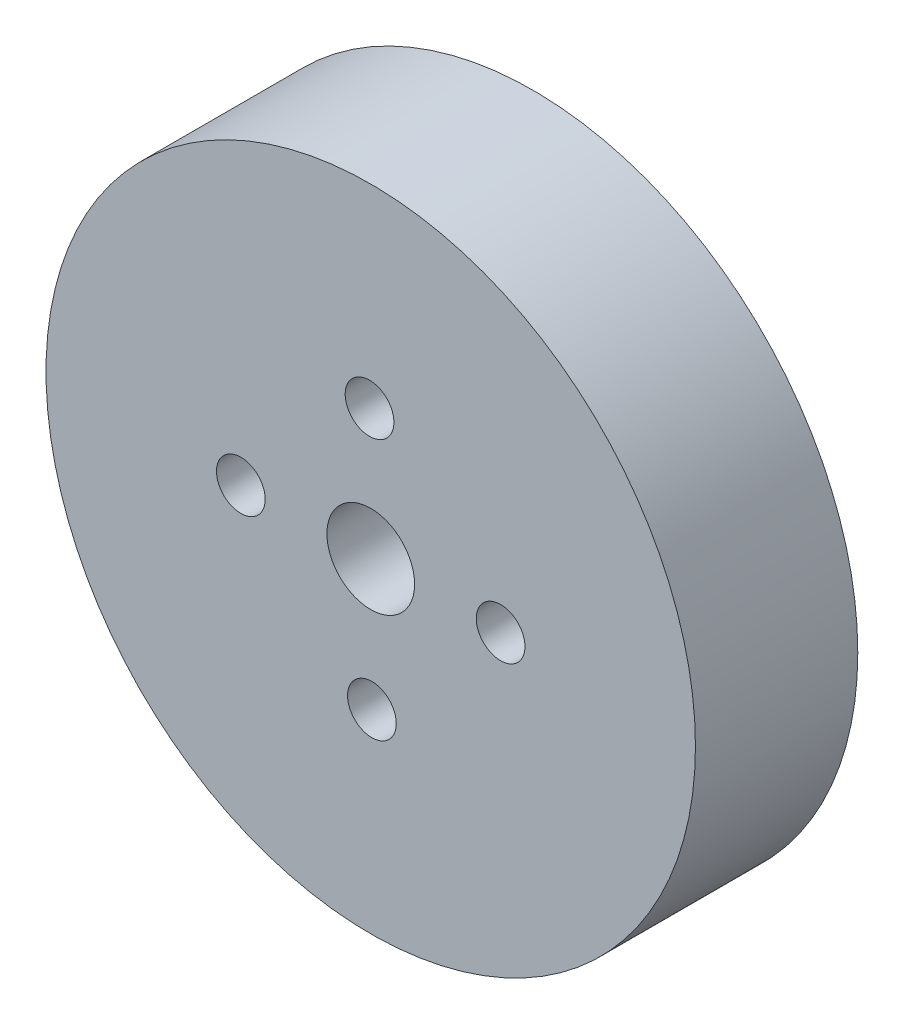
ISO-10303-21;
HEADER;
FILE_DESCRIPTION(('STEP AP214'),'2;1');
FILE_NAME('part.step','',(''),(''),'','','');
FILE_SCHEMA(('AUTOMOTIVE_DESIGN { 1 0 10303 214 1 1 1 1 }'));
ENDSEC;
DATA;
#1=APPLICATION_CONTEXT('core data for automotive mechanical design processes');
#2=APPLICATION_PROTOCOL_DEFINITION('international standard','automotive_design',2000,#1);
#3=PRODUCT_CONTEXT('',#1,'mechanical');
#4=PRODUCT('Part','Part','',(#3));
#5=PRODUCT_RELATED_PRODUCT_CATEGORY('part','',(#4));
#6=PRODUCT_DEFINITION_FORMATION('','',#4);
#7=PRODUCT_DEFINITION_CONTEXT('part definition',#1,'design');
#8=PRODUCT_DEFINITION('design','',#6,#7);
#9=PRODUCT_DEFINITION_SHAPE('','',#8);
#10=(LENGTH_UNIT() NAMED_UNIT(*) SI_UNIT(.MILLI.,.METRE.));
#11=(NAMED_UNIT(*) PLANE_ANGLE_UNIT() SI_UNIT($,.RADIAN.));
#12=(NAMED_UNIT(*) SI_UNIT($,.STERADIAN.) SOLID_ANGLE_UNIT());
#13=UNCERTAINTY_MEASURE_WITH_UNIT(LENGTH_MEASURE(1.E-05),#10,'distance_accuracy_value','');
#14=(GEOMETRIC_REPRESENTATION_CONTEXT(3) GLOBAL_UNCERTAINTY_ASSIGNED_CONTEXT((#13)) GLOBAL_UNIT_ASSIGNED_CONTEXT((#10,
#11,#12)) REPRESENTATION_CONTEXT('',''));
#15=CARTESIAN_POINT('',(0.,0.,0.));
#16=DIRECTION('',(0.,0.,1.));
#17=DIRECTION('',(1.,0.,0.));
#18=AXIS2_PLACEMENT_3D('',#15,#16,#17);
#19=CARTESIAN_POINT('',(0.,0.,10.));
#20=DIRECTION('',(0.,0.,1.));
#21=DIRECTION('',(1.,0.,0.));
#22=AXIS2_PLACEMENT_3D('',#19,#20,#21);
#23=PLANE('',#22);
#24=CARTESIAN_POINT('',(8.,0.0726317109347044,10.));
#25=DIRECTION('',(0.,0.,1.));
#26=DIRECTION('',(1.,0.,0.));
#27=AXIS2_PLACEMENT_3D('',#24,#25,#26);
#28=CIRCLE('',#27,1.5);
#29=CARTESIAN_POINT('',(9.5,0.0726317109347044,10.));
#30=VERTEX_POINT('',#29);
#31=EDGE_CURVE('E59',#30,#30,#28,.T.);
#32=ORIENTED_EDGE('',*,*,#31,.F.);
#33=EDGE_LOOP('',(#32));
#34=FACE_BOUND('',#33,.T.);
#35=CARTESIAN_POINT('',(-8.,-0.0726317109347035,10.));
#36=DIRECTION('',(0.,0.,1.));
#37=DIRECTION('',(1.,0.,0.));
#38=AXIS2_PLACEMENT_3D('',#35,#36,#37);
#39=CIRCLE('',#38,1.5);
#40=CARTESIAN_POINT('',(-6.5,-0.0726317109347035,10.));
#41=VERTEX_POINT('',#40);
#42=EDGE_CURVE('E47',#41,#41,#39,.T.);
#43=ORIENTED_EDGE('',*,*,#42,.F.);
#44=EDGE_LOOP('',(#43));
#45=FACE_BOUND('',#44,.T.);
#46=CARTESIAN_POINT('',(0.,0.,10.));
#47=DIRECTION('',(0.,0.,1.));
#48=DIRECTION('',(1.,0.,0.));
#49=AXIS2_PLACEMENT_3D('',#46,#47,#48);
#50=CIRCLE('',#49,20.);
#51=CARTESIAN_POINT('',(20.,0.,10.));
#52=VERTEX_POINT('',#51);
#53=EDGE_CURVE('E10',#52,#52,#50,.T.);
#54=ORIENTED_EDGE('',*,*,#53,.T.);
#55=EDGE_LOOP('',(#54));
#56=FACE_BOUND('',#55,.T.);
#57=CARTESIAN_POINT('',(0.,0.,10.));
#58=DIRECTION('',(0.,0.,1.));
#59=DIRECTION('',(1.,0.,0.));
#60=AXIS2_PLACEMENT_3D('',#57,#58,#59);
#61=CIRCLE('',#60,2.7);
#62=CARTESIAN_POINT('',(2.7,0.,10.));
#63=VERTEX_POINT('',#62);
#64=EDGE_CURVE('E42',#63,#63,#61,.T.);
#65=ORIENTED_EDGE('',*,*,#64,.F.);
#66=EDGE_LOOP('',(#65));
#67=FACE_BOUND('',#66,.T.);
#68=CARTESIAN_POINT('',(-0.0726317109347039,8.,10.));
#69=DIRECTION('',(0.,0.,1.));
#70=DIRECTION('',(1.,0.,0.));
#71=AXIS2_PLACEMENT_3D('',#68,#69,#70);
#72=CIRCLE('',#71,1.5);
#73=CARTESIAN_POINT('',(1.4273682890653,8.,10.));
#74=VERTEX_POINT('',#73);
#75=EDGE_CURVE('E53',#74,#74,#72,.T.);
#76=ORIENTED_EDGE('',*,*,#75,.F.);
#77=EDGE_LOOP('',(#76));
#78=FACE_BOUND('',#77,.T.);
#79=CARTESIAN_POINT('',(0.0726317109347049,-8.,10.));
#80=DIRECTION('',(0.,0.,1.));
#81=DIRECTION('',(1.,0.,0.));
#82=AXIS2_PLACEMENT_3D('',#79,#80,#81);
#83=CIRCLE('',#82,1.5);
#84=CARTESIAN_POINT('',(1.5726317109347,-8.,10.));
#85=VERTEX_POINT('',#84);
#86=EDGE_CURVE('E65',#85,#85,#83,.T.);
#87=ORIENTED_EDGE('',*,*,#86,.F.);
#88=EDGE_LOOP('',(#87));
#89=FACE_BOUND('',#88,.T.);
#90=ADVANCED_FACE('F31',(#34,#45,#56,#67,#78,#89),#23,.T.);
#91=CARTESIAN_POINT('',(0.,0.,0.));
#92=DIRECTION('',(0.,0.,1.));
#93=DIRECTION('',(1.,0.,0.));
#94=AXIS2_PLACEMENT_3D('',#91,#92,#93);
#95=PLANE('',#94);
#96=CARTESIAN_POINT('',(0.,0.,0.));
#97=DIRECTION('',(0.,0.,1.));
#98=DIRECTION('',(1.,0.,0.));
#99=AXIS2_PLACEMENT_3D('',#96,#97,#98);
#100=CIRCLE('',#99,20.);
#101=CARTESIAN_POINT('',(20.,0.,0.));
#102=VERTEX_POINT('',#101);
#103=EDGE_CURVE('E35',#102,#102,#100,.T.);
#104=ORIENTED_EDGE('',*,*,#103,.F.);
#105=EDGE_LOOP('',(#104));
#106=FACE_BOUND('',#105,.T.);
#107=CARTESIAN_POINT('',(0.,0.,0.));
#108=DIRECTION('',(0.,0.,1.));
#109=DIRECTION('',(1.,0.,0.));
#110=AXIS2_PLACEMENT_3D('',#107,#108,#109);
#111=CIRCLE('',#110,2.7);
#112=CARTESIAN_POINT('',(2.7,0.,0.));
#113=VERTEX_POINT('',#112);
#114=EDGE_CURVE('E44',#113,#113,#111,.T.);
#115=ORIENTED_EDGE('',*,*,#114,.T.);
#116=EDGE_LOOP('',(#115));
#117=FACE_BOUND('',#116,.T.);
#118=CARTESIAN_POINT('',(-8.,-0.0726317109347035,0.));
#119=DIRECTION('',(0.,0.,1.));
#120=DIRECTION('',(1.,0.,0.));
#121=AXIS2_PLACEMENT_3D('',#118,#119,#120);
#122=CIRCLE('',#121,1.5);
#123=CARTESIAN_POINT('',(-6.5,-0.0726317109347035,0.));
#124=VERTEX_POINT('',#123);
#125=EDGE_CURVE('E50',#124,#124,#122,.T.);
#126=ORIENTED_EDGE('',*,*,#125,.T.);
#127=EDGE_LOOP('',(#126));
#128=FACE_BOUND('',#127,.T.);
#129=CARTESIAN_POINT('',(-0.0726317109347039,8.,0.));
#130=DIRECTION('',(0.,0.,1.));
#131=DIRECTION('',(1.,0.,0.));
#132=AXIS2_PLACEMENT_3D('',#129,#130,#131);
#133=CIRCLE('',#132,1.5);
#134=CARTESIAN_POINT('',(1.4273682890653,8.,0.));
#135=VERTEX_POINT('',#134);
#136=EDGE_CURVE('E56',#135,#135,#133,.T.);
#137=ORIENTED_EDGE('',*,*,#136,.T.);
#138=EDGE_LOOP('',(#137));
#139=FACE_BOUND('',#138,.T.);
#140=CARTESIAN_POINT('',(8.,0.0726317109347044,0.));
#141=DIRECTION('',(0.,0.,1.));
#142=DIRECTION('',(1.,0.,0.));
#143=AXIS2_PLACEMENT_3D('',#140,#141,#142);
#144=CIRCLE('',#143,1.5);
#145=CARTESIAN_POINT('',(9.5,0.0726317109347044,0.));
#146=VERTEX_POINT('',#145);
#147=EDGE_CURVE('E62',#146,#146,#144,.T.);
#148=ORIENTED_EDGE('',*,*,#147,.T.);
#149=EDGE_LOOP('',(#148));
#150=FACE_BOUND('',#149,.T.);
#151=CARTESIAN_POINT('',(0.0726317109347049,-8.,0.));
#152=DIRECTION('',(0.,0.,1.));
#153=DIRECTION('',(1.,0.,0.));
#154=AXIS2_PLACEMENT_3D('',#151,#152,#153);
#155=CIRCLE('',#154,1.5);
#156=CARTESIAN_POINT('',(1.5726317109347,-8.,0.));
#157=VERTEX_POINT('',#156);
#158=EDGE_CURVE('E68',#157,#157,#155,.T.);
#159=ORIENTED_EDGE('',*,*,#158,.T.);
#160=EDGE_LOOP('',(#159));
#161=FACE_BOUND('',#160,.T.);
#162=ADVANCED_FACE('F78',(#106,#117,#128,#139,#150,#161),#95,.F.);
#163=CARTESIAN_POINT('',(0.,0.,10.));
#164=DIRECTION('',(0.,0.,-1.));
#165=DIRECTION('',(-1.,0.,0.));
#166=AXIS2_PLACEMENT_3D('',#163,#164,#165);
#167=CYLINDRICAL_SURFACE('',#166,20.);
#168=ORIENTED_EDGE('',*,*,#53,.F.);
#169=EDGE_LOOP('',(#168));
#170=FACE_BOUND('',#169,.T.);
#171=ORIENTED_EDGE('',*,*,#103,.T.);
#172=EDGE_LOOP('',(#171));
#173=FACE_BOUND('',#172,.T.);
#174=ADVANCED_FACE('F33',(#170,#173),#167,.T.);
#175=CARTESIAN_POINT('',(0.,0.,10.));
#176=DIRECTION('',(0.,0.,-1.));
#177=DIRECTION('',(-1.,0.,0.));
#178=AXIS2_PLACEMENT_3D('',#175,#176,#177);
#179=CYLINDRICAL_SURFACE('',#178,2.7);
#180=ORIENTED_EDGE('',*,*,#64,.T.);
#181=EDGE_LOOP('',(#180));
#182=FACE_BOUND('',#181,.T.);
#183=ORIENTED_EDGE('',*,*,#114,.F.);
#184=EDGE_LOOP('',(#183));
#185=FACE_BOUND('',#184,.T.);
#186=ADVANCED_FACE('F88',(#182,#185),#179,.F.);
#187=CARTESIAN_POINT('',(-8.,-0.0726317109347035,10.));
#188=DIRECTION('',(0.,0.,-1.));
#189=DIRECTION('',(-1.,0.,0.));
#190=AXIS2_PLACEMENT_3D('',#187,#188,#189);
#191=CYLINDRICAL_SURFACE('',#190,1.5);
#192=ORIENTED_EDGE('',*,*,#42,.T.);
#193=EDGE_LOOP('',(#192));
#194=FACE_BOUND('',#193,.T.);
#195=ORIENTED_EDGE('',*,*,#125,.F.);
#196=EDGE_LOOP('',(#195));
#197=FACE_BOUND('',#196,.T.);
#198=ADVANCED_FACE('F91',(#194,#197),#191,.F.);
#199=CARTESIAN_POINT('',(-0.0726317109347039,8.,10.));
#200=DIRECTION('',(0.,0.,-1.));
#201=DIRECTION('',(-1.,0.,0.));
#202=AXIS2_PLACEMENT_3D('',#199,#200,#201);
#203=CYLINDRICAL_SURFACE('',#202,1.5);
#204=ORIENTED_EDGE('',*,*,#75,.T.);
#205=EDGE_LOOP('',(#204));
#206=FACE_BOUND('',#205,.T.);
#207=ORIENTED_EDGE('',*,*,#136,.F.);
#208=EDGE_LOOP('',(#207));
#209=FACE_BOUND('',#208,.T.);
#210=ADVANCED_FACE('F95',(#206,#209),#203,.F.);
#211=CARTESIAN_POINT('',(8.,0.0726317109347044,10.));
#212=DIRECTION('',(0.,0.,-1.));
#213=DIRECTION('',(-1.,0.,0.));
#214=AXIS2_PLACEMENT_3D('',#211,#212,#213);
#215=CYLINDRICAL_SURFACE('',#214,1.5);
#216=ORIENTED_EDGE('',*,*,#31,.T.);
#217=EDGE_LOOP('',(#216));
#218=FACE_BOUND('',#217,.T.);
#219=ORIENTED_EDGE('',*,*,#147,.F.);
#220=EDGE_LOOP('',(#219));
#221=FACE_BOUND('',#220,.T.);
#222=ADVANCED_FACE('F99',(#218,#221),#215,.F.);
#223=CARTESIAN_POINT('',(0.0726317109347049,-8.,10.));
#224=DIRECTION('',(0.,0.,-1.));
#225=DIRECTION('',(-1.,0.,0.));
#226=AXIS2_PLACEMENT_3D('',#223,#224,#225);
#227=CYLINDRICAL_SURFACE('',#226,1.5);
#228=ORIENTED_EDGE('',*,*,#86,.T.);
#229=EDGE_LOOP('',(#228));
#230=FACE_BOUND('',#229,.T.);
#231=ORIENTED_EDGE('',*,*,#158,.F.);
#232=EDGE_LOOP('',(#231));
#233=FACE_BOUND('',#232,.T.);
#234=ADVANCED_FACE('F74',(#230,#233),#227,.F.);
#235=CLOSED_SHELL('',(#90,#162,#174,#186,#198,#210,#222,#234));
#236=MANIFOLD_SOLID_BREP('B2',#235);
#237=ADVANCED_BREP_SHAPE_REPRESENTATION('',(#18,#236),#14);
#238=SHAPE_DEFINITION_REPRESENTATION(#9,#237);
ENDSEC;
END-ISO-10303-21;
